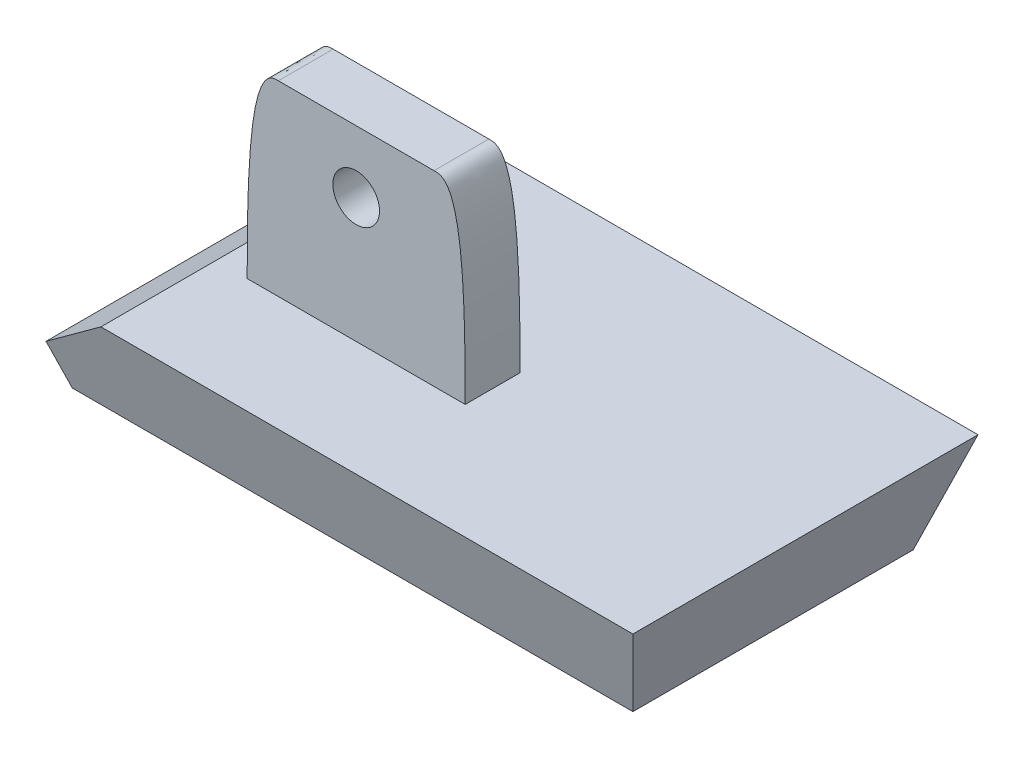
ISO-10303-21;
HEADER;
FILE_DESCRIPTION(('STEP AP214'),'2;1');
FILE_NAME('part.step','',(''),(''),'','','');
FILE_SCHEMA(('AUTOMOTIVE_DESIGN { 1 0 10303 214 1 1 1 1 }'));
ENDSEC;
DATA;
#1=APPLICATION_CONTEXT('core data for automotive mechanical design processes');
#2=APPLICATION_PROTOCOL_DEFINITION('international standard','automotive_design',2000,#1);
#3=PRODUCT_CONTEXT('',#1,'mechanical');
#4=PRODUCT('Part','Part','',(#3));
#5=PRODUCT_RELATED_PRODUCT_CATEGORY('part','',(#4));
#6=PRODUCT_DEFINITION_FORMATION('','',#4);
#7=PRODUCT_DEFINITION_CONTEXT('part definition',#1,'design');
#8=PRODUCT_DEFINITION('design','',#6,#7);
#9=PRODUCT_DEFINITION_SHAPE('','',#8);
#10=(LENGTH_UNIT() NAMED_UNIT(*) SI_UNIT(.MILLI.,.METRE.));
#11=(NAMED_UNIT(*) PLANE_ANGLE_UNIT() SI_UNIT($,.RADIAN.));
#12=(NAMED_UNIT(*) SI_UNIT($,.STERADIAN.) SOLID_ANGLE_UNIT());
#13=UNCERTAINTY_MEASURE_WITH_UNIT(LENGTH_MEASURE(1.E-05),#10,'distance_accuracy_value','');
#14=(GEOMETRIC_REPRESENTATION_CONTEXT(3) GLOBAL_UNCERTAINTY_ASSIGNED_CONTEXT((#13)) GLOBAL_UNIT_ASSIGNED_CONTEXT((#10,
#11,#12)) REPRESENTATION_CONTEXT('',''));
#15=CARTESIAN_POINT('',(0.,0.,0.));
#16=DIRECTION('',(0.,0.,1.));
#17=DIRECTION('',(1.,0.,0.));
#18=AXIS2_PLACEMENT_3D('',#15,#16,#17);
#19=CARTESIAN_POINT('',(0.,32.,0.));
#20=DIRECTION('',(0.,-1.,0.));
#21=DIRECTION('',(0.,0.,-1.));
#22=AXIS2_PLACEMENT_3D('',#19,#20,#21);
#23=PLANE('',#22);
#24=DIRECTION('',(1.,0.,0.));
#25=VECTOR('',#24,1.);
#26=CARTESIAN_POINT('',(0.,32.,-55.397430279453));
#27=LINE('',#26,#25);
#28=CARTESIAN_POINT('',(100.397430279453,32.,-55.397430279453));
#29=VERTEX_POINT('',#28);
#30=CARTESIAN_POINT('',(-70.3974302794528,32.,-55.397430279453));
#31=VERTEX_POINT('',#30);
#32=EDGE_CURVE('E275',#29,#31,#27,.F.);
#33=ORIENTED_EDGE('',*,*,#32,.T.);
#34=DIRECTION('',(0.,0.,1.));
#35=VECTOR('',#34,1.);
#36=CARTESIAN_POINT('',(-70.3974302794528,32.,0.));
#37=LINE('',#36,#35);
#38=CARTESIAN_POINT('',(-70.3974302794528,32.,55.397430279453));
#39=VERTEX_POINT('',#38);
#40=EDGE_CURVE('E240',#31,#39,#37,.T.);
#41=ORIENTED_EDGE('',*,*,#40,.T.);
#42=DIRECTION('',(-1.,0.,0.));
#43=VECTOR('',#42,1.);
#44=CARTESIAN_POINT('',(0.,32.,55.397430279453));
#45=LINE('',#44,#43);
#46=CARTESIAN_POINT('',(100.397430279453,32.,55.397430279453));
#47=VERTEX_POINT('',#46);
#48=EDGE_CURVE('E272',#39,#47,#45,.F.);
#49=ORIENTED_EDGE('',*,*,#48,.T.);
#50=DIRECTION('',(0.,0.,1.));
#51=VECTOR('',#50,1.);
#52=CARTESIAN_POINT('',(100.397430279453,32.,0.));
#53=LINE('',#52,#51);
#54=EDGE_CURVE('E279',#47,#29,#53,.F.);
#55=ORIENTED_EDGE('',*,*,#54,.T.);
#56=EDGE_LOOP('',(#33,#41,#49,#55));
#57=FACE_BOUND('',#56,.T.);
#58=CARTESIAN_POINT('',(-60.3450715743179,32.,0.018478512598466));
#59=CARTESIAN_POINT('',(-60.3450715743179,32.,6.47183759480695));
#60=CARTESIAN_POINT('',(-60.3450715743179,32.,12.9251966770154));
#61=CARTESIAN_POINT('',(-60.3450715743179,32.,19.3785557592239));
#62=B_SPLINE_CURVE_WITH_KNOTS('',3,(#58,#59,#60,#61),.UNSPECIFIED.,.F.,.F.,(4,4),
(-0.0193785557592239,-1.84785125984625E-05),.UNSPECIFIED.);
#63=CARTESIAN_POINT('',(-60.3450715743179,32.,0.898482023808711));
#64=VERTEX_POINT('',#63);
#65=CARTESIAN_POINT('',(-60.3450715743179,32.,18.4985522480137));
#66=VERTEX_POINT('',#65);
#67=EDGE_CURVE('E114',#64,#66,#62,.T.);
#68=ORIENTED_EDGE('',*,*,#67,.F.);
#69=DIRECTION('',(-1.,0.,0.));
#70=VECTOR('',#69,1.);
#71=CARTESIAN_POINT('',(-60.3450715743179,32.,0.898482023808711));
#72=LINE('',#71,#70);
#73=CARTESIAN_POINT('',(9.65492842568211,32.,0.898482023808711));
#74=VERTEX_POINT('',#73);
#75=EDGE_CURVE('E117',#74,#64,#72,.T.);
#76=ORIENTED_EDGE('',*,*,#75,.F.);
#77=CARTESIAN_POINT('',(9.65492842568211,32.,19.3785557592239));
#78=CARTESIAN_POINT('',(9.65492842568211,32.,12.9251966770154));
#79=CARTESIAN_POINT('',(9.65492842568211,32.,6.47183759480695));
#80=CARTESIAN_POINT('',(9.65492842568211,32.,0.0184785125984632));
#81=B_SPLINE_CURVE_WITH_KNOTS('',3,(#77,#78,#79,#80),.UNSPECIFIED.,.F.,.F.,(4,4),
(1.84785125984625E-05,0.0193785557592239),.UNSPECIFIED.);
#82=CARTESIAN_POINT('',(9.65492842568211,32.,18.4985522480137));
#83=VERTEX_POINT('',#82);
#84=EDGE_CURVE('E138',#83,#74,#81,.T.);
#85=ORIENTED_EDGE('',*,*,#84,.F.);
#86=DIRECTION('',(1.,0.,0.));
#87=VECTOR('',#86,1.);
#88=CARTESIAN_POINT('',(-60.3450715743179,32.,18.4985522480137));
#89=LINE('',#88,#87);
#90=EDGE_CURVE('E120',#66,#83,#89,.T.);
#91=ORIENTED_EDGE('',*,*,#90,.F.);
#92=EDGE_LOOP('',(#68,#76,#85,#91));
#93=FACE_BOUND('',#92,.T.);
#94=ADVANCED_FACE('F44',(#57,#93),#23,.F.);
#95=CARTESIAN_POINT('',(90.,0.,45.));
#96=DIRECTION('',(0.951056516295153,-0.309016994374948,0.));
#97=DIRECTION('',(0.309016994374948,0.951056516295154,0.));
#98=AXIS2_PLACEMENT_3D('',#95,#96,#97);
#99=PLANE('',#98);
#100=DIRECTION('',(0.,0.,-1.));
#101=VECTOR('',#100,1.);
#102=CARTESIAN_POINT('',(90.,0.,45.));
#103=LINE('',#102,#101);
#104=CARTESIAN_POINT('',(90.,0.,45.));
#105=VERTEX_POINT('',#104);
#106=CARTESIAN_POINT('',(90.,0.,-45.));
#107=VERTEX_POINT('',#106);
#108=EDGE_CURVE('E294',#105,#107,#103,.T.);
#109=ORIENTED_EDGE('',*,*,#108,.T.);
#110=DIRECTION('',(-0.295241808844326,-0.908660854566026,0.295241808844326));
#111=VECTOR('',#110,1.);
#112=CARTESIAN_POINT('',(74.3098093758595,-48.2894413790589,-29.3098093758594));
#113=LINE('',#112,#111);
#114=EDGE_CURVE('E259',#29,#107,#113,.T.);
#115=ORIENTED_EDGE('',*,*,#114,.F.);
#116=ORIENTED_EDGE('',*,*,#54,.F.);
#117=DIRECTION('',(-0.295241808844326,-0.908660854566026,-0.295241808844326));
#118=VECTOR('',#117,1.);
#119=CARTESIAN_POINT('',(90.,0.,45.));
#120=LINE('',#119,#118);
#121=EDGE_CURVE('E268',#47,#105,#120,.T.);
#122=ORIENTED_EDGE('',*,*,#121,.T.);
#123=EDGE_LOOP('',(#109,#115,#116,#122));
#124=FACE_BOUND('',#123,.T.);
#125=ADVANCED_FACE('F229',(#124),#99,.T.);
#126=CARTESIAN_POINT('',(-90.,0.,-45.));
#127=DIRECTION('',(0.,-0.309016994374948,-0.951056516295153));
#128=DIRECTION('',(0.,0.951056516295154,-0.309016994374948));
#129=AXIS2_PLACEMENT_3D('',#126,#127,#128);
#130=PLANE('',#129);
#131=DIRECTION('',(0.295241808844326,-0.908660854566026,0.295241808844326));
#132=VECTOR('',#131,1.);
#133=CARTESIAN_POINT('',(-82.1549046879297,-24.1447206895294,-37.1549046879297));
#134=LINE('',#133,#132);
#135=CARTESIAN_POINT('',(-94.217090391954,12.9788696740969,-49.217090391954));
#136=VERTEX_POINT('',#135);
#137=CARTESIAN_POINT('',(-90.,0.,-45.));
#138=VERTEX_POINT('',#137);
#139=EDGE_CURVE('E262',#136,#138,#134,.T.);
#140=ORIENTED_EDGE('',*,*,#139,.F.);
#141=DIRECTION('',(-0.765839670744293,-0.611559363868871,0.198707682736663));
#142=VECTOR('',#141,1.);
#143=CARTESIAN_POINT('',(-78.8277129621438,25.2680187360225,-53.2100769721158));
#144=LINE('',#143,#142);
#145=EDGE_CURVE('E12',#136,#31,#144,.F.);
#146=ORIENTED_EDGE('',*,*,#145,.T.);
#147=ORIENTED_EDGE('',*,*,#32,.F.);
#148=ORIENTED_EDGE('',*,*,#114,.T.);
#149=DIRECTION('',(-1.,0.,0.));
#150=VECTOR('',#149,1.);
#151=CARTESIAN_POINT('',(-90.,0.,-45.));
#152=LINE('',#151,#150);
#153=EDGE_CURVE('E290',#107,#138,#152,.T.);
#154=ORIENTED_EDGE('',*,*,#153,.T.);
#155=EDGE_LOOP('',(#140,#146,#147,#148,#154));
#156=FACE_BOUND('',#155,.T.);
#157=ADVANCED_FACE('F468',(#156),#130,.T.);
#158=CARTESIAN_POINT('',(-90.,0.,45.));
#159=DIRECTION('',(-0.951056516295153,-0.309016994374948,0.));
#160=DIRECTION('',(0.309016994374948,-0.951056516295154,0.));
#161=AXIS2_PLACEMENT_3D('',#158,#159,#160);
#162=PLANE('',#161);
#163=DIRECTION('',(0.295241808844326,-0.908660854566026,-0.295241808844326));
#164=VECTOR('',#163,1.);
#165=CARTESIAN_POINT('',(-90.,0.,45.));
#166=LINE('',#165,#164);
#167=CARTESIAN_POINT('',(-94.217090391954,12.9788696740969,49.217090391954));
#168=VERTEX_POINT('',#167);
#169=CARTESIAN_POINT('',(-90.,0.,45.));
#170=VERTEX_POINT('',#169);
#171=EDGE_CURVE('E265',#168,#170,#166,.T.);
#172=ORIENTED_EDGE('',*,*,#171,.F.);
#173=DIRECTION('',(0.,0.,1.));
#174=VECTOR('',#173,1.);
#175=CARTESIAN_POINT('',(-94.217090391954,12.9788696740969,45.));
#176=LINE('',#175,#174);
#177=EDGE_CURVE('E52',#168,#136,#176,.F.);
#178=ORIENTED_EDGE('',*,*,#177,.T.);
#179=ORIENTED_EDGE('',*,*,#139,.T.);
#180=DIRECTION('',(0.,0.,1.));
#181=VECTOR('',#180,1.);
#182=CARTESIAN_POINT('',(-90.,0.,45.));
#183=LINE('',#182,#181);
#184=EDGE_CURVE('E286',#138,#170,#183,.T.);
#185=ORIENTED_EDGE('',*,*,#184,.T.);
#186=EDGE_LOOP('',(#172,#178,#179,#185));
#187=FACE_BOUND('',#186,.T.);
#188=ADVANCED_FACE('F461',(#187),#162,.T.);
#189=CARTESIAN_POINT('',(-90.,0.,45.));
#190=DIRECTION('',(0.,-0.309016994374948,0.951056516295153));
#191=DIRECTION('',(0.,-0.951056516295154,-0.309016994374948));
#192=AXIS2_PLACEMENT_3D('',#189,#190,#191);
#193=PLANE('',#192);
#194=ORIENTED_EDGE('',*,*,#48,.F.);
#195=DIRECTION('',(0.765839670744293,0.611559363868871,0.198707682736663));
#196=VECTOR('',#195,1.);
#197=CARTESIAN_POINT('',(-78.8277129621438,25.2680187360225,53.2100769721158));
#198=LINE('',#197,#196);
#199=EDGE_CURVE('E66',#39,#168,#198,.F.);
#200=ORIENTED_EDGE('',*,*,#199,.T.);
#201=ORIENTED_EDGE('',*,*,#171,.T.);
#202=DIRECTION('',(1.,0.,0.));
#203=VECTOR('',#202,1.);
#204=CARTESIAN_POINT('',(-90.,0.,45.));
#205=LINE('',#204,#203);
#206=EDGE_CURVE('E283',#170,#105,#205,.T.);
#207=ORIENTED_EDGE('',*,*,#206,.T.);
#208=ORIENTED_EDGE('',*,*,#121,.F.);
#209=EDGE_LOOP('',(#194,#200,#201,#207,#208));
#210=FACE_BOUND('',#209,.T.);
#211=ADVANCED_FACE('F432',(#210),#193,.T.);
#212=CARTESIAN_POINT('',(0.,0.,0.));
#213=DIRECTION('',(0.,-1.,0.));
#214=DIRECTION('',(0.,0.,-1.));
#215=AXIS2_PLACEMENT_3D('',#212,#213,#214);
#216=PLANE('',#215);
#217=ORIENTED_EDGE('',*,*,#108,.F.);
#218=ORIENTED_EDGE('',*,*,#206,.F.);
#219=ORIENTED_EDGE('',*,*,#184,.F.);
#220=ORIENTED_EDGE('',*,*,#153,.F.);
#221=EDGE_LOOP('',(#217,#218,#219,#220));
#222=FACE_BOUND('',#221,.T.);
#223=ADVANCED_FACE('F234',(#222),#216,.T.);
#224=CARTESIAN_POINT('',(-60.3450715743179,92.,18.4985522480137));
#225=DIRECTION('',(0.,0.,-1.));
#226=DIRECTION('',(-1.,0.,0.));
#227=AXIS2_PLACEMENT_3D('',#224,#225,#226);
#228=PLANE('',#227);
#229=CARTESIAN_POINT('',(-25.3450715743179,72.,18.4985522480137));
#230=DIRECTION('',(0.,0.,-1.));
#231=DIRECTION('',(-1.,0.,0.));
#232=AXIS2_PLACEMENT_3D('',#229,#230,#231);
#233=CIRCLE('',#232,7.5);
#234=CARTESIAN_POINT('',(-32.8450715743179,72.,18.4985522480137));
#235=VERTEX_POINT('',#234);
#236=EDGE_CURVE('E125',#235,#235,#233,.F.);
#237=ORIENTED_EDGE('',*,*,#236,.F.);
#238=EDGE_LOOP('',(#237));
#239=FACE_BOUND('',#238,.T.);
#240=ORIENTED_EDGE('',*,*,#90,.T.);
#241=CARTESIAN_POINT('',(-0.345071574317889,92.,18.4985522480137));
#242=CARTESIAN_POINT('',(1.33690894102157,92.,18.4985522480137));
#243=CARTESIAN_POINT('',(3.01888945636104,92.,18.4985522480137));
#244=CARTESIAN_POINT('',(6.72599623754758,87.698484809835,18.4985522480137));
#245=CARTESIAN_POINT('',(8.93800922732128,74.4264068711929,18.4985522480137));
#246=CARTESIAN_POINT('',(9.65492842568211,52.1837661840736,18.4985522480137));
#247=CARTESIAN_POINT('',(9.65492842568211,42.0918830920368,18.4985522480137));
#248=CARTESIAN_POINT('',(9.65492842568211,32.,18.4985522480137));
#249=B_SPLINE_CURVE_WITH_KNOTS('',5,(#241,#242,#243,#244,#245,#246,#247,#248),.UNSPECIFIED.,.F.,
.F.,(6,2,6),(0.,0.5,1.),.UNSPECIFIED.);
#250=CARTESIAN_POINT('',(-0.345071574317887,92.,18.4985522480137));
#251=VERTEX_POINT('',#250);
#252=EDGE_CURVE('E249',#83,#251,#249,.F.);
#253=ORIENTED_EDGE('',*,*,#252,.T.);
#254=DIRECTION('',(1.,0.,0.));
#255=VECTOR('',#254,1.);
#256=CARTESIAN_POINT('',(-60.3450715743179,92.,18.4985522480137));
#257=LINE('',#256,#255);
#258=CARTESIAN_POINT('',(-50.3450715743179,92.,18.4985522480137));
#259=VERTEX_POINT('',#258);
#260=EDGE_CURVE('E137',#259,#251,#257,.T.);
#261=ORIENTED_EDGE('',*,*,#260,.F.);
#262=CARTESIAN_POINT('',(-60.3450715743179,32.,18.4985522480137));
#263=CARTESIAN_POINT('',(-60.3450715743179,42.0918830920368,18.4985522480137));
#264=CARTESIAN_POINT('',(-60.3450715743179,52.1837661840735,18.4985522480137));
#265=CARTESIAN_POINT('',(-59.6281523759571,74.4264068711929,18.4985522480137));
#266=CARTESIAN_POINT('',(-57.4161393861834,87.698484809835,18.4985522480137));
#267=CARTESIAN_POINT('',(-53.7090326049968,92.,18.4985522480137));
#268=CARTESIAN_POINT('',(-52.0270520896574,92.,18.4985522480137));
#269=CARTESIAN_POINT('',(-50.3450715743179,92.,18.4985522480137));
#270=B_SPLINE_CURVE_WITH_KNOTS('',5,(#262,#263,#264,#265,#266,#267,#268,#269),.UNSPECIFIED.,.F.,
.F.,(6,2,6),(0.,0.5,1.),.UNSPECIFIED.);
#271=EDGE_CURVE('E214',#259,#66,#270,.F.);
#272=ORIENTED_EDGE('',*,*,#271,.T.);
#273=EDGE_LOOP('',(#240,#253,#261,#272));
#274=FACE_BOUND('',#273,.T.);
#275=ADVANCED_FACE('F231',(#239,#274),#228,.F.);
#276=CARTESIAN_POINT('',(-60.3450715743179,92.,0.898482023808711));
#277=DIRECTION('',(0.,0.,1.));
#278=DIRECTION('',(1.,0.,0.));
#279=AXIS2_PLACEMENT_3D('',#276,#277,#278);
#280=PLANE('',#279);
#281=CARTESIAN_POINT('',(-25.3450715743179,72.,0.898482023808711));
#282=DIRECTION('',(0.,0.,-1.));
#283=DIRECTION('',(-1.,0.,0.));
#284=AXIS2_PLACEMENT_3D('',#281,#282,#283);
#285=CIRCLE('',#284,7.5);
#286=CARTESIAN_POINT('',(-32.8450715743179,72.,0.898482023808711));
#287=VERTEX_POINT('',#286);
#288=EDGE_CURVE('E310',#287,#287,#285,.T.);
#289=ORIENTED_EDGE('',*,*,#288,.F.);
#290=EDGE_LOOP('',(#289));
#291=FACE_BOUND('',#290,.T.);
#292=DIRECTION('',(-1.,0.,0.));
#293=VECTOR('',#292,1.);
#294=CARTESIAN_POINT('',(-60.3450715743179,92.,0.898482023808711));
#295=LINE('',#294,#293);
#296=CARTESIAN_POINT('',(-0.345071574317887,92.,0.898482023808711));
#297=VERTEX_POINT('',#296);
#298=CARTESIAN_POINT('',(-50.3450715743179,92.,0.898482023808711));
#299=VERTEX_POINT('',#298);
#300=EDGE_CURVE('E298',#297,#299,#295,.T.);
#301=ORIENTED_EDGE('',*,*,#300,.F.);
#302=CARTESIAN_POINT('',(9.65492842568211,32.,0.898482023808711));
#303=CARTESIAN_POINT('',(9.65492842568211,42.0918830920368,0.898482023808711));
#304=CARTESIAN_POINT('',(9.65492842568211,52.1837661840736,0.898482023808711));
#305=CARTESIAN_POINT('',(8.93800922732128,74.4264068711929,0.898482023808712));
#306=CARTESIAN_POINT('',(6.72599623754758,87.698484809835,0.898482023808712));
#307=CARTESIAN_POINT('',(3.01888945636104,92.,0.898482023808711));
#308=CARTESIAN_POINT('',(1.33690894102157,92.,0.898482023808711));
#309=CARTESIAN_POINT('',(-0.345071574317889,92.,0.898482023808711));
#310=B_SPLINE_CURVE_WITH_KNOTS('',5,(#302,#303,#304,#305,#306,#307,#308,#309),.UNSPECIFIED.,.F.,
.F.,(6,2,6),(0.,0.5,1.),.UNSPECIFIED.);
#311=EDGE_CURVE('E134',#297,#74,#310,.F.);
#312=ORIENTED_EDGE('',*,*,#311,.T.);
#313=ORIENTED_EDGE('',*,*,#75,.T.);
#314=CARTESIAN_POINT('',(-50.3450715743179,92.,0.898482023808711));
#315=CARTESIAN_POINT('',(-52.0270520896574,92.,0.898482023808711));
#316=CARTESIAN_POINT('',(-53.7090326049968,92.,0.898482023808711));
#317=CARTESIAN_POINT('',(-57.4161393861834,87.698484809835,0.898482023808711));
#318=CARTESIAN_POINT('',(-59.6281523759571,74.4264068711929,0.898482023808711));
#319=CARTESIAN_POINT('',(-60.3450715743179,52.1837661840736,0.898482023808711));
#320=CARTESIAN_POINT('',(-60.3450715743179,42.0918830920368,0.898482023808711));
#321=CARTESIAN_POINT('',(-60.3450715743179,32.,0.898482023808711));
#322=B_SPLINE_CURVE_WITH_KNOTS('',5,(#314,#315,#316,#317,#318,#319,#320,#321),.UNSPECIFIED.,.F.,
.F.,(6,2,6),(0.,0.5,1.),.UNSPECIFIED.);
#323=EDGE_CURVE('E131',#64,#299,#322,.F.);
#324=ORIENTED_EDGE('',*,*,#323,.T.);
#325=EDGE_LOOP('',(#301,#312,#313,#324));
#326=FACE_BOUND('',#325,.T.);
#327=ADVANCED_FACE('F130',(#291,#326),#280,.F.);
#328=CARTESIAN_POINT('',(0.,92.,0.));
#329=DIRECTION('',(0.,1.,0.));
#330=DIRECTION('',(0.,0.,1.));
#331=AXIS2_PLACEMENT_3D('',#328,#329,#330);
#332=PLANE('',#331);
#333=ORIENTED_EDGE('',*,*,#260,.T.);
#334=CARTESIAN_POINT('',(-0.345071574317889,92.,0.0184785125984632));
#335=CARTESIAN_POINT('',(-0.345071574317889,92.,6.47183759480695));
#336=CARTESIAN_POINT('',(-0.345071574317889,92.,12.9251966770154));
#337=CARTESIAN_POINT('',(-0.345071574317889,92.,19.3785557592239));
#338=B_SPLINE_CURVE_WITH_KNOTS('',3,(#334,#335,#336,#337),.UNSPECIFIED.,.F.,.F.,(4,4),
(1.84785125984632E-05,0.0193785557592239),.UNSPECIFIED.);
#339=EDGE_CURVE('E147',#251,#297,#338,.F.);
#340=ORIENTED_EDGE('',*,*,#339,.T.);
#341=ORIENTED_EDGE('',*,*,#300,.T.);
#342=CARTESIAN_POINT('',(-50.3450715743179,92.,19.3785557592239));
#343=CARTESIAN_POINT('',(-50.3450715743179,92.,12.9251966770154));
#344=CARTESIAN_POINT('',(-50.3450715743179,92.,6.47183759480695));
#345=CARTESIAN_POINT('',(-50.3450715743179,92.,0.018478512598466));
#346=B_SPLINE_CURVE_WITH_KNOTS('',3,(#342,#343,#344,#345),.UNSPECIFIED.,.F.,.F.,(4,4),
(-0.0193785557592239,-1.84785125984632E-05),.UNSPECIFIED.);
#347=EDGE_CURVE('E144',#299,#259,#346,.F.);
#348=ORIENTED_EDGE('',*,*,#347,.T.);
#349=EDGE_LOOP('',(#333,#340,#341,#348));
#350=FACE_BOUND('',#349,.T.);
#351=ADVANCED_FACE('F329',(#350),#332,.T.);
#352=CARTESIAN_POINT('',(-25.3450715743179,72.,39.7117556836101));
#353=DIRECTION('',(0.,0.,-1.));
#354=DIRECTION('',(-1.,0.,0.));
#355=AXIS2_PLACEMENT_3D('',#352,#353,#354);
#356=CYLINDRICAL_SURFACE('',#355,7.5);
#357=ORIENTED_EDGE('',*,*,#236,.T.);
#358=EDGE_LOOP('',(#357));
#359=FACE_BOUND('',#358,.T.);
#360=ORIENTED_EDGE('',*,*,#288,.T.);
#361=EDGE_LOOP('',(#360));
#362=FACE_BOUND('',#361,.T.);
#363=ADVANCED_FACE('F338',(#359,#362),#356,.F.);
#364=CARTESIAN_POINT('',(9.65492842568211,32.,0.0184785125984632));
#365=CARTESIAN_POINT('',(9.65492842568211,32.,6.47183759480695));
#366=CARTESIAN_POINT('',(9.65492842568211,32.,12.9251966770154));
#367=CARTESIAN_POINT('',(9.65492842568211,32.,19.3785557592239));
#368=CARTESIAN_POINT('',(9.65492842568211,42.0918830920368,0.0184785125984632));
#369=CARTESIAN_POINT('',(9.65492842568211,42.0918830920368,6.47183759480695));
#370=CARTESIAN_POINT('',(9.65492842568211,42.0918830920368,12.9251966770154));
#371=CARTESIAN_POINT('',(9.65492842568211,42.0918830920368,19.3785557592239));
#372=CARTESIAN_POINT('',(9.65492842568211,52.1837661840736,0.0184785125984632));
#373=CARTESIAN_POINT('',(9.65492842568211,52.1837661840736,6.47183759480695));
#374=CARTESIAN_POINT('',(9.65492842568211,52.1837661840736,12.9251966770154));
#375=CARTESIAN_POINT('',(9.65492842568211,52.1837661840736,19.3785557592239));
#376=CARTESIAN_POINT('',(8.93800922732128,74.4264068711929,0.0184785125984632));
#377=CARTESIAN_POINT('',(8.93800922732128,74.4264068711929,6.47183759480696));
#378=CARTESIAN_POINT('',(8.93800922732128,74.4264068711929,12.9251966770154));
#379=CARTESIAN_POINT('',(8.93800922732128,74.4264068711929,19.3785557592239));
#380=CARTESIAN_POINT('',(6.72599623754758,87.698484809835,0.0184785125984632));
#381=CARTESIAN_POINT('',(6.72599623754758,87.698484809835,6.47183759480696));
#382=CARTESIAN_POINT('',(6.72599623754758,87.698484809835,12.9251966770154));
#383=CARTESIAN_POINT('',(6.72599623754758,87.698484809835,19.3785557592239));
#384=CARTESIAN_POINT('',(3.01888945636104,92.,0.0184785125984632));
#385=CARTESIAN_POINT('',(3.01888945636104,92.,6.47183759480695));
#386=CARTESIAN_POINT('',(3.01888945636104,92.,12.9251966770154));
#387=CARTESIAN_POINT('',(3.01888945636104,92.,19.3785557592239));
#388=CARTESIAN_POINT('',(1.33690894102157,92.,0.0184785125984632));
#389=CARTESIAN_POINT('',(1.33690894102157,92.,6.47183759480695));
#390=CARTESIAN_POINT('',(1.33690894102157,92.,12.9251966770154));
#391=CARTESIAN_POINT('',(1.33690894102157,92.,19.3785557592239));
#392=CARTESIAN_POINT('',(-0.345071574317889,92.,0.0184785125984632));
#393=CARTESIAN_POINT('',(-0.345071574317889,92.,6.47183759480695));
#394=CARTESIAN_POINT('',(-0.345071574317889,92.,12.9251966770154));
#395=CARTESIAN_POINT('',(-0.345071574317889,92.,19.3785557592239));
#396=B_SPLINE_SURFACE_WITH_KNOTS('',5,3,((#364,#365,#366,#367),(#368,#369,#370,#371),(#372,#373,
#374,#375),(#376,#377,#378,#379),(#380,#381,#382,#383),(#384,#385,#386,#387),(#388,#389,#390,
#391),(#392,#393,#394,#395)),.UNSPECIFIED.,.F.,.F.,.F.,(6,2,6),(4,4),(0.,0.5,1.),
(1.84785125984632E-05,0.0193785557592239),.UNSPECIFIED.);
#397=ORIENTED_EDGE('',*,*,#252,.F.);
#398=ORIENTED_EDGE('',*,*,#84,.T.);
#399=ORIENTED_EDGE('',*,*,#311,.F.);
#400=ORIENTED_EDGE('',*,*,#339,.F.);
#401=EDGE_LOOP('',(#397,#398,#399,#400));
#402=FACE_BOUND('',#401,.T.);
#403=ADVANCED_FACE('F168',(#402),#396,.T.);
#404=CARTESIAN_POINT('',(-60.3450715743179,32.,19.3785557592239));
#405=CARTESIAN_POINT('',(-60.3450715743179,32.,12.9251966770154));
#406=CARTESIAN_POINT('',(-60.3450715743179,32.,6.47183759480695));
#407=CARTESIAN_POINT('',(-60.3450715743179,32.,0.018478512598466));
#408=CARTESIAN_POINT('',(-60.3450715743179,42.0918830920368,19.3785557592239));
#409=CARTESIAN_POINT('',(-60.3450715743179,42.0918830920368,12.9251966770154));
#410=CARTESIAN_POINT('',(-60.3450715743179,42.0918830920368,6.47183759480695));
#411=CARTESIAN_POINT('',(-60.3450715743179,42.0918830920368,0.018478512598466));
#412=CARTESIAN_POINT('',(-60.3450715743179,52.1837661840736,19.3785557592239));
#413=CARTESIAN_POINT('',(-60.3450715743179,52.1837661840736,12.9251966770154));
#414=CARTESIAN_POINT('',(-60.3450715743179,52.1837661840736,6.47183759480695));
#415=CARTESIAN_POINT('',(-60.3450715743179,52.1837661840736,0.018478512598466));
#416=CARTESIAN_POINT('',(-59.6281523759571,74.4264068711929,19.3785557592239));
#417=CARTESIAN_POINT('',(-59.6281523759571,74.4264068711929,12.9251966770154));
#418=CARTESIAN_POINT('',(-59.6281523759571,74.4264068711929,6.47183759480695));
#419=CARTESIAN_POINT('',(-59.6281523759571,74.4264068711929,0.018478512598466));
#420=CARTESIAN_POINT('',(-57.4161393861834,87.698484809835,19.3785557592239));
#421=CARTESIAN_POINT('',(-57.4161393861834,87.698484809835,12.9251966770154));
#422=CARTESIAN_POINT('',(-57.4161393861834,87.698484809835,6.47183759480695));
#423=CARTESIAN_POINT('',(-57.4161393861834,87.698484809835,0.018478512598466));
#424=CARTESIAN_POINT('',(-53.7090326049968,92.,19.3785557592239));
#425=CARTESIAN_POINT('',(-53.7090326049968,92.,12.9251966770154));
#426=CARTESIAN_POINT('',(-53.7090326049968,92.,6.47183759480695));
#427=CARTESIAN_POINT('',(-53.7090326049968,92.,0.018478512598466));
#428=CARTESIAN_POINT('',(-52.0270520896574,92.,19.3785557592239));
#429=CARTESIAN_POINT('',(-52.0270520896574,92.,12.9251966770154));
#430=CARTESIAN_POINT('',(-52.0270520896574,92.,6.47183759480695));
#431=CARTESIAN_POINT('',(-52.0270520896574,92.,0.018478512598466));
#432=CARTESIAN_POINT('',(-50.3450715743179,92.,19.3785557592239));
#433=CARTESIAN_POINT('',(-50.3450715743179,92.,12.9251966770154));
#434=CARTESIAN_POINT('',(-50.3450715743179,92.,6.47183759480695));
#435=CARTESIAN_POINT('',(-50.3450715743179,92.,0.018478512598466));
#436=B_SPLINE_SURFACE_WITH_KNOTS('',5,3,((#404,#405,#406,#407),(#408,#409,#410,#411),(#412,#413,
#414,#415),(#416,#417,#418,#419),(#420,#421,#422,#423),(#424,#425,#426,#427),(#428,#429,#430,
#431),(#432,#433,#434,#435)),.UNSPECIFIED.,.F.,.F.,.F.,(6,2,6),(4,4),(0.,0.5,1.),
(-0.0193785557592239,-1.84785125984632E-05),.UNSPECIFIED.);
#437=ORIENTED_EDGE('',*,*,#323,.F.);
#438=ORIENTED_EDGE('',*,*,#67,.T.);
#439=ORIENTED_EDGE('',*,*,#271,.F.);
#440=ORIENTED_EDGE('',*,*,#347,.F.);
#441=EDGE_LOOP('',(#437,#438,#439,#440));
#442=FACE_BOUND('',#441,.T.);
#443=ADVANCED_FACE('F142',(#442),#436,.T.);
#444=CARTESIAN_POINT('',(-70.3974302794528,32.,0.));
#445=DIRECTION('',(-0.624002725307143,0.781422164267983,0.));
#446=DIRECTION('',(0.,0.,-1.));
#447=AXIS2_PLACEMENT_3D('',#444,#445,#446);
#448=PLANE('',#447);
#449=ORIENTED_EDGE('',*,*,#145,.F.);
#450=ORIENTED_EDGE('',*,*,#177,.F.);
#451=ORIENTED_EDGE('',*,*,#199,.F.);
#452=ORIENTED_EDGE('',*,*,#40,.F.);
#453=EDGE_LOOP('',(#449,#450,#451,#452));
#454=FACE_BOUND('',#453,.T.);
#455=ADVANCED_FACE('F46',(#454),#448,.T.);
#456=CLOSED_SHELL('',(#94,#125,#157,#188,#211,#223,#275,#327,#351,#363,#403,#443,#455));
#457=MANIFOLD_SOLID_BREP('B2',#456);
#458=ADVANCED_BREP_SHAPE_REPRESENTATION('',(#18,#457),#14);
#459=SHAPE_DEFINITION_REPRESENTATION(#9,#458);
ENDSEC;
END-ISO-10303-21;
